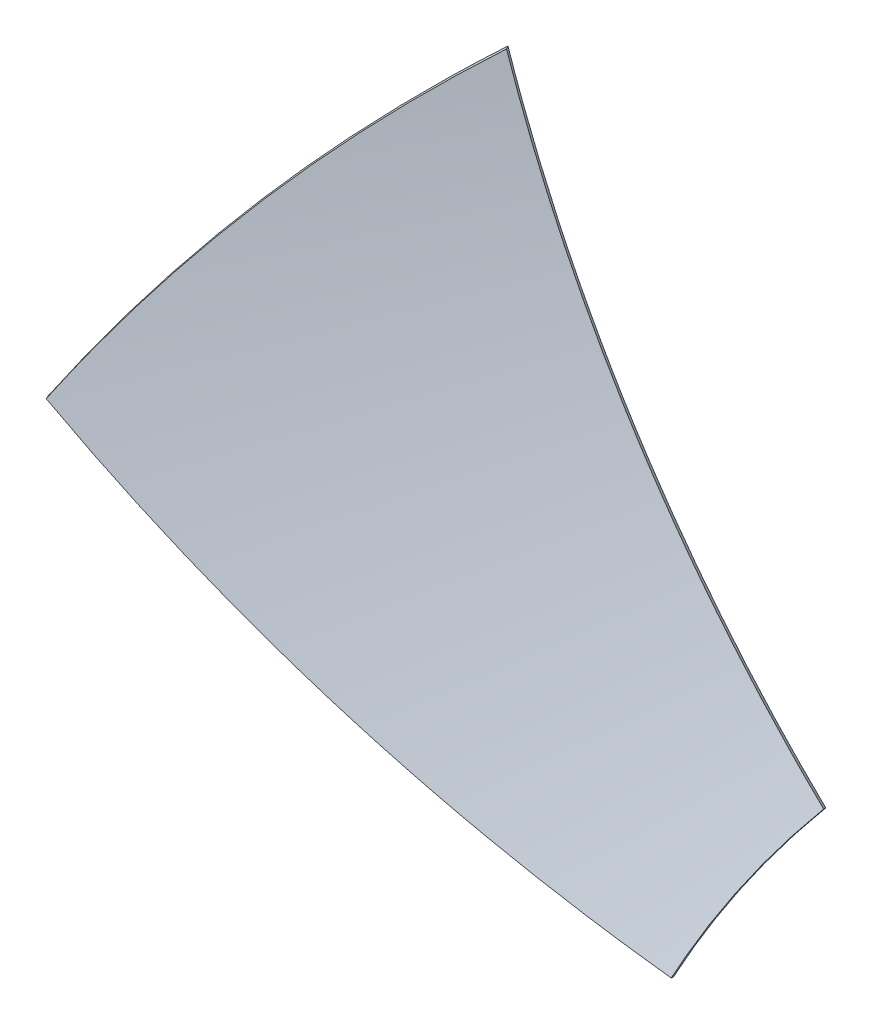
ISO-10303-21;
HEADER;
FILE_DESCRIPTION(('STEP AP214'),'2;1');
FILE_NAME('part.step','',(''),(''),'','','');
FILE_SCHEMA(('AUTOMOTIVE_DESIGN { 1 0 10303 214 1 1 1 1 }'));
ENDSEC;
DATA;
#1=APPLICATION_CONTEXT('core data for automotive mechanical design processes');
#2=APPLICATION_PROTOCOL_DEFINITION('international standard','automotive_design',2000,#1);
#3=PRODUCT_CONTEXT('',#1,'mechanical');
#4=PRODUCT('Part','Part','',(#3));
#5=PRODUCT_RELATED_PRODUCT_CATEGORY('part','',(#4));
#6=PRODUCT_DEFINITION_FORMATION('','',#4);
#7=PRODUCT_DEFINITION_CONTEXT('part definition',#1,'design');
#8=PRODUCT_DEFINITION('design','',#6,#7);
#9=PRODUCT_DEFINITION_SHAPE('','',#8);
#10=(LENGTH_UNIT() NAMED_UNIT(*) SI_UNIT(.MILLI.,.METRE.));
#11=(NAMED_UNIT(*) PLANE_ANGLE_UNIT() SI_UNIT($,.RADIAN.));
#12=(NAMED_UNIT(*) SI_UNIT($,.STERADIAN.) SOLID_ANGLE_UNIT());
#13=UNCERTAINTY_MEASURE_WITH_UNIT(LENGTH_MEASURE(1.E-05),#10,'distance_accuracy_value','');
#14=(GEOMETRIC_REPRESENTATION_CONTEXT(3) GLOBAL_UNCERTAINTY_ASSIGNED_CONTEXT((#13)) GLOBAL_UNIT_ASSIGNED_CONTEXT((#10,
#11,#12)) REPRESENTATION_CONTEXT('',''));
#15=CARTESIAN_POINT('',(0.,0.,0.));
#16=DIRECTION('',(0.,0.,1.));
#17=DIRECTION('',(1.,0.,0.));
#18=AXIS2_PLACEMENT_3D('',#15,#16,#17);
#19=CARTESIAN_POINT('',(145.88739410171,-91.911066445134,-2.70380006520948));
#20=DIRECTION('',(0.,0.,1.));
#21=DIRECTION('',(1.,0.,0.));
#22=AXIS2_PLACEMENT_3D('',#19,#20,#21);
#23=CONICAL_SURFACE('',#22,60.5897364806196,0.959931088596881);
#24=CARTESIAN_POINT('',(110.448391037649,-131.359852117449,-7.99752302693613));
#25=CARTESIAN_POINT('',(110.454538378891,-131.33527791501,-8.01319997647154));
#26=CARTESIAN_POINT('',(110.460747337562,-131.31072775871,-8.02889045343355));
#27=CARTESIAN_POINT('',(110.473289806102,-131.261668621047,-8.06030283110231));
#28=CARTESIAN_POINT('',(110.479623352552,-131.237159654142,-8.07602473978305));
#29=CARTESIAN_POINT('',(110.492414670215,-131.188182884035,-8.1074999805224));
#30=CARTESIAN_POINT('',(110.498872480102,-131.163715096312,-8.12325332094998));
#31=CARTESIAN_POINT('',(110.511911996494,-131.114820668208,-8.15479142477998));
#32=CARTESIAN_POINT('',(110.518493743735,-131.090394044334,-8.17057619693309));
#33=CARTESIAN_POINT('',(110.53178080752,-131.041581925538,-8.20217716383617));
#34=CARTESIAN_POINT('',(110.538486166829,-131.017196448162,-8.21799336770532));
#35=CARTESIAN_POINT('',(110.552020127447,-130.968466600916,-8.24965719767816));
#36=CARTESIAN_POINT('',(110.558848773518,-130.944122249635,-8.26550483325642));
#37=CARTESIAN_POINT('',(110.572628981121,-130.895474631146,-8.29723152627678));
#38=CARTESIAN_POINT('',(110.579580589382,-130.871171383577,-8.31311059353581));
#39=CARTESIAN_POINT('',(110.593606393392,-130.822605943894,-8.34490014964352));
#40=CARTESIAN_POINT('',(110.600680637807,-130.798343772477,-8.36081064863856));
#41=CARTESIAN_POINT('',(110.607814502788,-130.774107256312,-8.37673348223085));
#42=B_SPLINE_CURVE_WITH_KNOTS('',3,(#24,#25,#26,#27,#28,#29,#30,#31,#32,#33,#34,#35,#36,#37,#38,
#39,#40,#41),.UNSPECIFIED.,.F.,.F.,(4,2,2,2,2,2,2,2,4),(0.,0.0893701156271062,0.178766876104449,
0.26819192389929,0.3576468943739,0.447133415688347,0.536653108704645,0.626207586892681,
0.715798456237738),.UNSPECIFIED.);
#43=CARTESIAN_POINT('',(110.44839103765,-131.359852117449,-7.99752302693662));
#44=VERTEX_POINT('',#43);
#45=CARTESIAN_POINT('',(110.607814502788,-130.774107256312,-8.37673348223085));
#46=VERTEX_POINT('',#45);
#47=EDGE_CURVE('E94',#44,#46,#42,.T.);
#48=ORIENTED_EDGE('',*,*,#47,.T.);
#49=CARTESIAN_POINT('',(110.607814827989,-130.774106151476,-8.37673420808281));
#50=CARTESIAN_POINT('',(110.639985249908,-130.66481646931,-8.44853525519903));
#51=CARTESIAN_POINT('',(110.673371042051,-130.556032682132,-8.52059749338112));
#52=CARTESIAN_POINT('',(110.846357850817,-130.014446759972,-8.8823363479189));
#53=CARTESIAN_POINT('',(111.003866832167,-129.589571257958,-9.17568986823083));
#54=CARTESIAN_POINT('',(111.204234658725,-129.114694741501,-9.51462891427878));
#55=CARTESIAN_POINT('',(111.229853898745,-129.055049107714,-9.5574063098381));
#56=CARTESIAN_POINT('',(111.300852809613,-128.892630388317,-9.67445619647831));
#57=CARTESIAN_POINT('',(111.346963223349,-128.790263728789,-9.74885055962443));
#58=CARTESIAN_POINT('',(111.556786564493,-128.337876696355,-10.0804044230892));
#59=CARTESIAN_POINT('',(111.73227018741,-127.994570661752,-10.339494905144));
#60=CARTESIAN_POINT('',(111.974425559886,-127.562240649262,-10.6757424167337));
#61=CARTESIAN_POINT('',(112.029918144488,-127.465694289271,-10.7514987322279));
#62=CARTESIAN_POINT('',(112.277253447827,-127.046248573761,-11.0835809668324));
#63=CARTESIAN_POINT('',(112.479732946404,-126.730674718622,-11.3411904059437));
#64=CARTESIAN_POINT('',(112.693672900404,-126.423618868208,-11.5999996128496));
#65=B_SPLINE_CURVE_WITH_KNOTS('',3,(#49,#50,#51,#52,#53,#54,#55,#56,#57,#58,#59,#60,#61,#62,#63,
#64),.UNSPECIFIED.,.F.,.F.,(4,2,2,2,2,2,2,4),(0.,0.404038905860809,2.02133371872121,
2.25456208219033,2.65859884190079,4.05094813615728,4.45498439560415,5.81918410717478),.UNSPECIFIED.);
#66=CARTESIAN_POINT('',(112.693672901725,-126.423618866313,-11.5999996144472));
#67=VERTEX_POINT('',#66);
#68=EDGE_CURVE('E96',#46,#67,#65,.T.);
#69=ORIENTED_EDGE('',*,*,#68,.T.);
#70=CARTESIAN_POINT('',(112.693672903556,-126.423618864908,-11.5999996160449));
#71=CARTESIAN_POINT('',(112.595443491919,-126.32914324304,-11.5999996494659));
#72=CARTESIAN_POINT('',(112.497620847767,-126.234241239663,-11.6000047399862));
#73=CARTESIAN_POINT('',(112.010504651611,-125.757568613982,-11.6000530761267));
#74=CARTESIAN_POINT('',(111.627366940537,-125.369467727088,-11.6001649766072));
#75=CARTESIAN_POINT('',(110.874672406272,-124.580337034854,-11.6004735845133));
#76=CARTESIAN_POINT('',(110.505115565175,-124.179307246562,-11.600670291827));
#77=CARTESIAN_POINT('',(109.77994696766,-123.364826499554,-11.6010958966151));
#78=CARTESIAN_POINT('',(109.424335195753,-122.951375554637,-11.6013247940537));
#79=CARTESIAN_POINT('',(108.727432053638,-122.112583556248,-11.6017712994751));
#80=CARTESIAN_POINT('',(108.386140670623,-121.687242513411,-11.601988907468));
#81=CARTESIAN_POINT('',(107.718225980457,-120.825178471598,-11.6023789968126));
#82=CARTESIAN_POINT('',(107.391602663457,-120.388455480264,-11.6025514781945));
#83=CARTESIAN_POINT('',(106.91297812094,-119.725293872102,-11.6027589088282));
#84=CARTESIAN_POINT('',(106.755329936813,-119.502906117604,-11.6028195019006));
#85=CARTESIAN_POINT('',(106.288038561008,-118.831710549119,-11.6029726866684));
#86=CARTESIAN_POINT('',(105.984083850709,-118.378917637858,-11.6030366646339));
#87=CARTESIAN_POINT('',(105.391725381369,-117.463292887788,-11.6030799623009));
#88=CARTESIAN_POINT('',(105.1033216208,-117.000461049964,-11.6030592820107));
#89=CARTESIAN_POINT('',(104.542381135892,-116.065258822996,-11.602935824296));
#90=CARTESIAN_POINT('',(104.269844413669,-115.592888432579,-11.6028330468605));
#91=CARTESIAN_POINT('',(103.873227738378,-114.87765432379,-11.6026274061353));
#92=CARTESIAN_POINT('',(103.743060286484,-114.63814299101,-11.6025502856898));
#93=CARTESIAN_POINT('',(103.358657594349,-113.916270515776,-11.6022970818008));
#94=CARTESIAN_POINT('',(103.110551650931,-113.430622256323,-11.6020991678266));
#95=CARTESIAN_POINT('',(102.631041171035,-112.451167853839,-11.6016733387524));
#96=CARTESIAN_POINT('',(102.399636646344,-111.957361705052,-11.6014454236312));
#97=CARTESIAN_POINT('',(101.953833512893,-110.962112767205,-11.6009981951424));
#98=CARTESIAN_POINT('',(101.739434919909,-110.460669971061,-11.6007788817827));
#99=CARTESIAN_POINT('',(101.430856227974,-109.703271550478,-11.6004924206081));
#100=CARTESIAN_POINT('',(101.330171692084,-109.44994706742,-11.6004040220411));
#101=CARTESIAN_POINT('',(100.982433904178,-108.552637769441,-11.6001296377125));
#102=CARTESIAN_POINT('',(100.747180438028,-107.904072354456,-11.6000013307995));
#103=CARTESIAN_POINT('',(100.526180104955,-107.250547083312,-11.5999996160446));
#104=B_SPLINE_CURVE_WITH_KNOTS('',3,(#70,#71,#72,#73,#74,#75,#76,#77,#78,#79,#80,#81,#82,#83,
#84,#85,#86,#87,#88,#89,#90,#91,#92,#93,#94,#95,#96,#97,#98,#99,#100,#101,#102,#103),
.UNSPECIFIED.,.F.,.F.,(4,2,2,2,2,2,2,2,2,2,2,2,2,2,2,2,4),(0.,0.408872020730124,2.0445880705708,
3.68030196370055,5.31601403985159,6.95172465303242,8.5874341677969,9.40520007116332,
11.0409086372335,12.6766170425655,14.3123256660651,15.1300915957316,16.7658012532861,
18.4015120650839,20.0372243942951,20.8549909197946,22.92420054412),.UNSPECIFIED.);
#105=CARTESIAN_POINT('',(100.52618009027,-107.250547073115,-11.5999996085913));
#106=VERTEX_POINT('',#105);
#107=EDGE_CURVE('E73',#67,#106,#104,.T.);
#108=ORIENTED_EDGE('',*,*,#107,.T.);
#109=CARTESIAN_POINT('',(100.526180075585,-107.250547062919,-11.599999601138));
#110=CARTESIAN_POINT('',(100.441324936392,-107.325385260621,-11.5269277928142));
#111=CARTESIAN_POINT('',(100.356768987596,-107.400629395655,-11.4539215705748));
#112=CARTESIAN_POINT('',(100.104012458659,-107.627604284732,-11.235097029347));
#113=CARTESIAN_POINT('',(99.9367365545802,-107.780565956176,-11.0894842771434));
#114=CARTESIAN_POINT('',(99.6877681144773,-108.012532305478,-10.8715012510655));
#115=CARTESIAN_POINT('',(99.6050972039884,-108.090280542329,-10.7989079062299));
#116=CARTESIAN_POINT('',(99.4404191975699,-108.246620471751,-10.6538718996196));
#117=CARTESIAN_POINT('',(99.3584121139781,-108.325212179935,-10.5814292406641));
#118=CARTESIAN_POINT('',(99.1130287548065,-108.562664759361,-10.3639882154032));
#119=CARTESIAN_POINT('',(98.9506948031759,-108.722826643187,-10.2192307695911));
#120=CARTESIAN_POINT('',(98.6287700418738,-109.04644467217,-9.93034021145841));
#121=CARTESIAN_POINT('',(98.4691793165495,-109.209900918284,-9.7862071184366));
#122=CARTESIAN_POINT('',(98.1525483149784,-109.539774771729,-9.49848601100203));
#123=CARTESIAN_POINT('',(97.995508257018,-109.706192629989,-9.35489804403862));
#124=CARTESIAN_POINT('',(97.6842210226098,-110.042155043292,-9.06835455091052));
#125=CARTESIAN_POINT('',(97.5299738283015,-110.211699578328,-8.92539902070576));
#126=CARTESIAN_POINT('',(97.2244515438564,-110.554011397179,-8.64017874156109));
#127=CARTESIAN_POINT('',(97.0731763960015,-110.726778618281,-8.49791397924668));
#128=CARTESIAN_POINT('',(96.773720308594,-111.075559721707,-8.21411210644342));
#129=CARTESIAN_POINT('',(96.6255393944931,-111.251573630714,-8.07257500194714));
#130=CARTESIAN_POINT('',(96.1857335171657,-111.78433788711,-7.64909816116586));
#131=CARTESIAN_POINT('',(95.8988003533564,-112.145861243344,-7.36825085191799));
#132=CARTESIAN_POINT('',(95.4782689179051,-112.69660987447,-6.94954274143506));
#133=CARTESIAN_POINT('',(95.3398972502636,-112.881375720383,-6.81056637979575));
#134=CARTESIAN_POINT('',(95.0663612922474,-113.253782293722,-6.53336775504512));
#135=CARTESIAN_POINT('',(94.9311966371304,-113.441422690184,-6.3951454075681));
#136=CARTESIAN_POINT('',(94.5305374479167,-114.008602419277,-5.98158599832814));
#137=CARTESIAN_POINT('',(94.2698842146468,-114.392391745062,-5.70736306325411));
#138=CARTESIAN_POINT('',(93.7619368186367,-115.170865573477,-5.16201392766748));
#139=CARTESIAN_POINT('',(93.5146426864306,-115.565550101007,-4.89088773423403));
#140=CARTESIAN_POINT('',(93.154183537094,-116.165468508236,-4.48668057052745));
#141=CARTESIAN_POINT('',(93.0357831029994,-116.366746410406,-4.35236513137622));
#142=CARTESIAN_POINT('',(92.7044963021591,-116.942250503265,-3.97199708233509));
#143=CARTESIAN_POINT('',(92.4958647468823,-117.319605559852,-3.72694510964173));
#144=CARTESIAN_POINT('',(92.0911163029729,-118.08338601503,-3.23966354679029));
#145=CARTESIAN_POINT('',(91.8950120710661,-118.469820063786,-2.99743700701945));
#146=CARTESIAN_POINT('',(91.7056010996255,-118.860514200795,-2.75685890943749));
#147=B_SPLINE_CURVE_WITH_KNOTS('',3,(#109,#110,#111,#112,#113,#114,#115,#116,#117,#118,#119,
#120,#121,#122,#123,#124,#125,#126,#127,#128,#129,#130,#131,#132,#133,#134,#135,#136,#137,#138,
#139,#140,#141,#142,#143,#144,#145,#146),.UNSPECIFIED.,.F.,.F.,(4,2,2,2,2,2,2,2,2,2,2,2,2,2,2,2,
2,2,4),(0.,0.404064071678144,1.21225536084814,1.61640707214662,2.02056627777049,2.8308529751671,
3.64116454242181,4.45154509470655,5.26192046269926,6.07228007729671,6.88264635489911,
8.50314002327528,9.31144192690703,10.1196514551796,11.736108176728,13.3525685927589,
14.1607187110391,15.6483307902936,17.1374228229095),.UNSPECIFIED.);
#148=CARTESIAN_POINT('',(91.7056010996254,-118.860514200795,-2.75685890943717));
#149=VERTEX_POINT('',#148);
#150=EDGE_CURVE('E69',#106,#149,#147,.T.);
#151=ORIENTED_EDGE('',*,*,#150,.T.);
#152=CARTESIAN_POINT('',(91.7056010996253,-118.860514200795,-2.75685890943694));
#153=CARTESIAN_POINT('',(91.797999099969,-118.954591802416,-2.78545031277596));
#154=CARTESIAN_POINT('',(91.8907318193919,-119.04832956558,-2.81408465062322));
#155=CARTESIAN_POINT('',(92.3560886074387,-119.515344523519,-2.95747718472562));
#156=CARTESIAN_POINT('',(92.7336885822292,-119.883494085374,-3.07286579182448));
#157=CARTESIAN_POINT('',(93.4991116710984,-120.608606195914,-3.30487051877574));
#158=CARTESIAN_POINT('',(93.8869347739485,-120.965568756885,-3.42148663727982));
#159=CARTESIAN_POINT('',(94.4760436580709,-121.492413370511,-3.59725720170259));
#160=CARTESIAN_POINT('',(94.6736348441904,-121.666588723844,-3.65598625597299));
#161=CARTESIAN_POINT('',(95.2700921211457,-122.184820435745,-3.8326007829354));
#162=CARTESIAN_POINT('',(95.6726133770275,-122.524556166096,-3.9509050346662));
#163=CARTESIAN_POINT('',(96.2833887115879,-123.025258786922,-4.12913475600895));
#164=CARTESIAN_POINT('',(96.4881383962491,-123.19067023734,-4.18867134707746));
#165=CARTESIAN_POINT('',(97.1058917483487,-123.682455580297,-4.36767964680681));
#166=CARTESIAN_POINT('',(97.5223699394594,-124.004355333684,-4.48754113247319));
#167=CARTESIAN_POINT('',(98.1537233128239,-124.477981594323,-4.6680659002562));
#168=CARTESIAN_POINT('',(98.3652725280436,-124.634314191228,-4.72836067572357));
#169=CARTESIAN_POINT('',(99.0032496911098,-125.098681713732,-4.90963337826445));
#170=CARTESIAN_POINT('',(99.4329760059577,-125.402062290664,-5.03099071927939));
#171=CARTESIAN_POINT('',(100.300810563139,-125.996186841655,-5.27461141686636));
#172=CARTESIAN_POINT('',(100.738918795833,-126.286930830245,-5.39687477239637));
#173=CARTESIAN_POINT('',(101.623129447332,-126.85565727751,-5.64217874674722));
#174=CARTESIAN_POINT('',(102.069231857301,-127.133639750291,-5.7652193647088));
#175=CARTESIAN_POINT('',(102.96905203662,-127.676677712553,-6.01197262843066));
#176=CARTESIAN_POINT('',(103.422769800579,-127.941733211187,-6.13568527371509));
#177=CARTESIAN_POINT('',(104.337452265398,-128.458744304297,-6.38368969010932));
#178=CARTESIAN_POINT('',(104.798416963906,-128.710699903023,-6.5079814610312));
#179=CARTESIAN_POINT('',(105.727233270513,-129.201320743226,-6.75706738199267));
#180=CARTESIAN_POINT('',(106.195084878947,-129.439985984056,-6.8818615320567));
#181=CARTESIAN_POINT('',(107.137312505872,-129.903819011916,-7.13188626946939));
#182=CARTESIAN_POINT('',(107.611688527068,-130.12898679335,-7.25711685699898));
#183=CARTESIAN_POINT('',(108.867589792305,-130.703207822183,-7.58703757426469));
#184=CARTESIAN_POINT('',(109.654244139479,-131.040887534019,-7.7920575680131));
#185=CARTESIAN_POINT('',(110.448391037649,-131.359852117449,-7.99752302693662));
#186=B_SPLINE_CURVE_WITH_KNOTS('',3,(#152,#153,#154,#155,#156,#157,#158,#159,#160,#161,#162,
#163,#164,#165,#166,#167,#168,#169,#170,#171,#172,#173,#174,#175,#176,#177,#178,#179,#180,#181,
#182,#183,#184,#185),.UNSPECIFIED.,.F.,.F.,(4,2,2,2,2,2,2,2,2,2,2,2,2,2,2,2,4),(0.,
0.404785757843062,2.02408053151727,3.64337352671859,4.45295985208373,6.07225169933995,
6.88183799918349,8.50113035989841,9.31071683189178,10.9300108744862,12.5493030550257,
14.1685934457541,15.7878826900421,17.4071714089507,19.026460206653,20.6457496757599,
23.2857210131077),.UNSPECIFIED.);
#187=EDGE_CURVE('E24',#149,#44,#186,.T.);
#188=ORIENTED_EDGE('',*,*,#187,.T.);
#189=EDGE_LOOP('',(#48,#69,#108,#151,#188));
#190=FACE_BOUND('',#189,.T.);
#191=ADVANCED_FACE('F17',(#190),#23,.F.);
#192=CARTESIAN_POINT('',(110.370961529788,-131.446042466957,-8.16299173988275));
#193=CARTESIAN_POINT('',(110.371217072719,-131.445758010358,-8.16244563851989));
#194=CARTESIAN_POINT('',(110.371472615649,-131.445473553759,-8.16189953715703));
#195=CARTESIAN_POINT('',(110.371728158579,-131.44518909716,-8.16135343579417));
#196=CARTESIAN_POINT('',(110.397282451603,-131.416743437256,-8.10674329950824));
#197=CARTESIAN_POINT('',(110.422836744626,-131.388297777353,-8.0521331632223));
#198=CARTESIAN_POINT('',(110.448391037649,-131.359852117449,-7.99752302693637));
#199=CARTESIAN_POINT('',(106.363861818276,-129.833425444528,-7.12789737510283));
#200=CARTESIAN_POINT('',(106.364139101076,-129.833160512215,-7.12735127373997));
#201=CARTESIAN_POINT('',(106.364416383877,-129.832895579903,-7.12680517237711));
#202=CARTESIAN_POINT('',(106.364693666677,-129.83263064759,-7.12625907101425));
#203=CARTESIAN_POINT('',(106.392421946705,-129.80613741632,-7.07164893472831));
#204=CARTESIAN_POINT('',(106.420145244575,-129.779641457908,-7.01703879844238));
#205=CARTESIAN_POINT('',(106.447873524603,-129.753148226638,-6.96242866215644));
#206=CARTESIAN_POINT('',(99.6234104154961,-126.149092471883,-5.31571711480843));
#207=CARTESIAN_POINT('',(99.6237205225811,-126.148864940785,-5.31517101344557));
#208=CARTESIAN_POINT('',(99.624030629666,-126.148637409686,-5.31462491208271));
#209=CARTESIAN_POINT('',(99.624340736751,-126.148409878588,-5.31407881071985));
#210=CARTESIAN_POINT('',(99.6553514452475,-126.125656768751,-5.25946867443392));
#211=CARTESIAN_POINT('',(99.6863640654172,-126.102904979998,-5.20485853814798));
#212=CARTESIAN_POINT('',(99.7173747739136,-126.080151870161,-5.15024840186205));
#213=CARTESIAN_POINT('',(93.8469783855449,-121.200618312325,-3.61624611019745));
#214=CARTESIAN_POINT('',(93.8473121958241,-121.200430805295,-3.61570000883459));
#215=CARTESIAN_POINT('',(93.8476460061032,-121.200243298264,-3.61515390747173));
#216=CARTESIAN_POINT('',(93.8479798163823,-121.200055791233,-3.61460780610887));
#217=CARTESIAN_POINT('',(93.881360844295,-121.181305088156,-3.55999766982294));
#218=CARTESIAN_POINT('',(93.9147412582133,-121.162553845972,-3.50538753353701));
#219=CARTESIAN_POINT('',(93.948122286126,-121.143803142895,-3.45077739725108));
#220=CARTESIAN_POINT('',(91.6018624798671,-118.912112687271,-2.92232762238329));
#221=CARTESIAN_POINT('',(91.6022048515495,-118.911942395236,-2.92178152102043));
#222=CARTESIAN_POINT('',(91.6025472232318,-118.911772103202,-2.92123541965757));
#223=CARTESIAN_POINT('',(91.6028895949142,-118.911601811167,-2.92068931829471));
#224=CARTESIAN_POINT('',(91.6371267631512,-118.89457260771,-2.86607918200878));
#225=CARTESIAN_POINT('',(91.6713639313882,-118.877543404253,-2.81146904572284));
#226=CARTESIAN_POINT('',(91.7056010996253,-118.860514200795,-2.75685890943691));
#227=B_SPLINE_SURFACE_WITH_KNOTS('',3,3,((#192,#193,#194,#195,#196,#197,#198),(#199,#200,#201,
#202,#203,#204,#205),(#206,#207,#208,#209,#210,#211,#212),(#213,#214,#215,#216,#217,#218,#219),
(#220,#221,#222,#223,#224,#225,#226)),.UNSPECIFIED.,.F.,.F.,.F.,(4,1,4),(4,3,4),(0.,
0.571428571428571,1.),(-0.01,0.,1.),.UNSPECIFIED.);
#228=DIRECTION('',(0.383314395357716,0.426684898557501,0.819152044283919));
#229=VECTOR('',#228,1.);
#230=CARTESIAN_POINT('',(110.41044291251,-131.402093922406,-8.07861907932099));
#231=LINE('',#230,#229);
#232=CARTESIAN_POINT('',(110.373505586871,-131.443209667115,-8.1575536178931));
#233=VERTEX_POINT('',#232);
#234=EDGE_CURVE('E82',#233,#44,#231,.T.);
#235=DIRECTION('',(-0.513557523553809,-0.255438051869439,-0.8191520442863));
#236=VECTOR('',#235,1.);
#237=CARTESIAN_POINT('',(91.65424534727,-118.886058005981,-2.8387741138661));
#238=LINE('',#237,#236);
#239=CARTESIAN_POINT('',(91.6028895910298,-118.9116018192,-2.92068931335491));
#240=VERTEX_POINT('',#239);
#241=EDGE_CURVE('E77',#149,#240,#238,.T.);
#242=CARTESIAN_POINT('',(110.373504997681,-131.443209430175,-8.1575534659389));
#243=CARTESIAN_POINT('',(110.252963072418,-131.394734157633,-8.12646529120606));
#244=CARTESIAN_POINT('',(110.132590927525,-131.345826370974,-8.09538661545343));
#245=CARTESIAN_POINT('',(109.531551155646,-131.099117256437,-7.94003106917737));
#246=CARTESIAN_POINT('',(109.053476821751,-130.894857479163,-7.81590131024393));
#247=CARTESIAN_POINT('',(108.103254325674,-130.472820642985,-7.56799500365023));
#248=CARTESIAN_POINT('',(107.631106157523,-130.255043597692,-7.4442184556344));
#249=CARTESIAN_POINT('',(106.693062857284,-129.806187918665,-7.19705562788169));
#250=CARTESIAN_POINT('',(106.227167721051,-129.57510929375,-7.07366934788614));
#251=CARTESIAN_POINT('',(105.302002163962,-129.099872298025,-6.82735063774555));
#252=CARTESIAN_POINT('',(104.842731741005,-128.855713931367,-6.70441820745653));
#253=CARTESIAN_POINT('',(103.474986563417,-128.103690598122,-6.33629505547561));
#254=CARTESIAN_POINT('',(102.576844056286,-127.576404780334,-6.09184856939984));
#255=CARTESIAN_POINT('',(101.252976826846,-126.747977871842,-5.72735750162617));
#256=CARTESIAN_POINT('',(100.815638910567,-126.465628362245,-5.60624052790909));
#257=CARTESIAN_POINT('',(99.9489750286305,-125.888500009708,-5.36480844305108));
#258=CARTESIAN_POINT('',(99.5196490721165,-125.593721152584,-5.24449333282534));
#259=CARTESIAN_POINT('',(98.8820235641118,-125.142372223197,-5.06473681624484));
#260=CARTESIAN_POINT('',(98.6705498090488,-124.990398117559,-5.00493947854554));
#261=CARTESIAN_POINT('',(98.0393015750367,-124.529889704488,-4.8258918912612));
#262=CARTESIAN_POINT('',(97.622731258631,-124.216790677508,-4.7069947901815));
#263=CARTESIAN_POINT('',(97.0045926740954,-123.738300763027,-4.52939440412343));
#264=CARTESIAN_POINT('',(96.7996732980041,-123.577336582714,-4.47032062315782));
#265=CARTESIAN_POINT('',(95.7803768583821,-122.764926080951,-4.17546759268048));
#266=CARTESIAN_POINT('',(94.9827954371385,-122.091396503552,-3.94149231997307));
#267=CARTESIAN_POINT('',(93.7579130379012,-120.996087732085,-3.57668669274213));
#268=CARTESIAN_POINT('',(93.3175612891433,-120.589236927786,-3.44436095392647));
#269=CARTESIAN_POINT('',(92.4501516014881,-119.761146057062,-3.18130270988215));
#270=CARTESIAN_POINT('',(92.0230930637054,-119.339906640672,-3.05057013304034));
#271=CARTESIAN_POINT('',(91.6028896336833,-118.911601850685,-2.92068933027757));
#272=B_SPLINE_CURVE_WITH_KNOTS('',3,(#242,#243,#244,#245,#246,#247,#248,#249,#250,#251,#252,
#253,#254,#255,#256,#257,#258,#259,#260,#261,#262,#263,#264,#265,#266,#267,#268,#269,#270,#271),
.UNSPECIFIED.,.F.,.F.,(4,2,2,2,2,2,2,2,2,2,2,2,2,2,4),(0.,0.400777878005566,2.00403380542941,
3.60728811828918,5.21054136822179,6.81379410946475,10.0212082771642,11.6244629152101,
13.2277193827625,14.0292898187264,15.6325469300771,16.4341171316611,19.6415535041823,
21.4831738583115,23.3247111233784),.UNSPECIFIED.);
#273=EDGE_CURVE('E158',#233,#240,#272,.T.);
#274=ORIENTED_EDGE('',*,*,#234,.T.);
#275=ORIENTED_EDGE('',*,*,#187,.F.);
#276=ORIENTED_EDGE('',*,*,#241,.T.);
#277=ORIENTED_EDGE('',*,*,#273,.F.);
#278=EDGE_LOOP('',(#274,#275,#276,#277));
#279=FACE_BOUND('',#278,.T.);
#280=ADVANCED_FACE('F79',(#279),#227,.F.);
#281=CARTESIAN_POINT('',(91.6018624798673,-118.912112687271,-2.9223276223835));
#282=CARTESIAN_POINT('',(91.6022048515497,-118.911942395236,-2.92178152102064));
#283=CARTESIAN_POINT('',(91.602547223232,-118.911772103202,-2.92123541965778));
#284=CARTESIAN_POINT('',(91.6028895949144,-118.911601811167,-2.92068931829492));
#285=CARTESIAN_POINT('',(91.6371267631514,-118.894572607709,-2.86607918200904));
#286=CARTESIAN_POINT('',(91.6713639313885,-118.877543404252,-2.81146904572316));
#287=CARTESIAN_POINT('',(91.7056010996256,-118.860514200795,-2.75685890943729));
#288=CARTESIAN_POINT('',(91.7059468950248,-118.86034220584,-2.7563073470608));
#289=CARTESIAN_POINT('',(91.706292690424,-118.860170210885,-2.75575578468432));
#290=CARTESIAN_POINT('',(91.7066384858232,-118.85999821593,-2.75520422230783));
#291=CARTESIAN_POINT('',(92.8888444789875,-116.250904025601,-4.55903629348514));
#292=CARTESIAN_POINT('',(92.889191941145,-116.250743955704,-4.55849019212228));
#293=CARTESIAN_POINT('',(92.8895394033026,-116.250583885806,-4.55794409075942));
#294=CARTESIAN_POINT('',(92.8898868654601,-116.250423815909,-4.55739798939656));
#295=CARTESIAN_POINT('',(92.9246330812129,-116.234416826181,-4.50278785311068));
#296=CARTESIAN_POINT('',(92.959376944454,-116.218408781574,-4.44817771682478));
#297=CARTESIAN_POINT('',(92.9941231602068,-116.202401791846,-4.3935675805389));
#298=CARTESIAN_POINT('',(92.9944740969859,-116.20224012125,-4.39301601816241));
#299=CARTESIAN_POINT('',(92.994825033765,-116.202078450653,-4.39246445578593));
#300=CARTESIAN_POINT('',(92.9951759705441,-116.201916780057,-4.39191289340944));
#301=CARTESIAN_POINT('',(95.0759582189656,-112.887087073722,-6.90064457452074));
#302=CARTESIAN_POINT('',(95.0763115968289,-112.886940536198,-6.90009847315788));
#303=CARTESIAN_POINT('',(95.0766649746922,-112.886793998673,-6.89955237179502));
#304=CARTESIAN_POINT('',(95.0770183525555,-112.886647461149,-6.89900627043216));
#305=CARTESIAN_POINT('',(95.1123561388839,-112.871993708715,-6.84439613414625));
#306=CARTESIAN_POINT('',(95.1476933550837,-112.857338547525,-6.78978599786036));
#307=CARTESIAN_POINT('',(95.1830311414121,-112.84268479509,-6.73517586157446));
#308=CARTESIAN_POINT('',(95.183388053054,-112.84253679219,-6.73462429919797));
#309=CARTESIAN_POINT('',(95.1837449646959,-112.842388789291,-6.73407273682148));
#310=CARTESIAN_POINT('',(95.1841018763379,-112.842240786391,-6.733521174445));
#311=CARTESIAN_POINT('',(97.6981704497479,-109.92269495487,-9.35519550010226));
#312=CARTESIAN_POINT('',(97.6985286187858,-109.922560987923,-9.3546493987394));
#313=CARTESIAN_POINT('',(97.6988867878238,-109.922427020975,-9.35410329737654));
#314=CARTESIAN_POINT('',(97.6992449568617,-109.922293054028,-9.35355719601368));
#315=CARTESIAN_POINT('',(97.7350618606562,-109.908896359294,-9.29894705972777));
#316=CARTESIAN_POINT('',(97.7708799431355,-109.8955022818,-9.24433692344185));
#317=CARTESIAN_POINT('',(97.8066968469301,-109.882105587066,-9.18972678715594));
#318=CARTESIAN_POINT('',(97.8070585976584,-109.881970280449,-9.18917522477945));
#319=CARTESIAN_POINT('',(97.8074203483868,-109.881834973832,-9.18862366240297));
#320=CARTESIAN_POINT('',(97.8077820991151,-109.881699667216,-9.18807210002648));
#321=CARTESIAN_POINT('',(99.1407985543467,-108.452492623889,-10.6557862259187));
#322=CARTESIAN_POINT('',(99.141159034587,-108.452365022112,-10.6552401245558));
#323=CARTESIAN_POINT('',(99.1415195148273,-108.452237420336,-10.654694023193));
#324=CARTESIAN_POINT('',(99.1418799950676,-108.452109818559,-10.6541479218301));
#325=CARTESIAN_POINT('',(99.1779280190991,-108.439349640885,-10.5995377855441));
#326=CARTESIAN_POINT('',(99.2139745859709,-108.426586581207,-10.5449276492582));
#327=CARTESIAN_POINT('',(99.2500226100024,-108.413826403533,-10.4903175129723));
#328=CARTESIAN_POINT('',(99.2503866950451,-108.413697525738,-10.4897659505958));
#329=CARTESIAN_POINT('',(99.2507507800878,-108.413568647944,-10.4892143882193));
#330=CARTESIAN_POINT('',(99.2511148651305,-108.413439770149,-10.4886628258428));
#331=CARTESIAN_POINT('',(99.8959753749966,-107.747473562299,-11.3171126533402));
#332=CARTESIAN_POINT('',(99.8963369151468,-107.747349024265,-11.3165665519773));
#333=CARTESIAN_POINT('',(99.896698455297,-107.747224486231,-11.3160204506145));
#334=CARTESIAN_POINT('',(99.8970599954472,-107.747099948197,-11.3154743492516));
#335=CARTESIAN_POINT('',(99.9332140104664,-107.734646144794,-11.2608642129657));
#336=CARTESIAN_POINT('',(99.9693701510365,-107.72219690909,-11.2062540766797));
#337=CARTESIAN_POINT('',(100.005524166056,-107.709743105687,-11.1516439403938));
#338=CARTESIAN_POINT('',(100.005889321608,-107.709617322273,-11.1510923780173));
#339=CARTESIAN_POINT('',(100.006254477159,-107.709491538858,-11.1505408156408));
#340=CARTESIAN_POINT('',(100.006619632711,-107.709365755444,-11.1499892532643));
#341=CARTESIAN_POINT('',(100.416423367232,-107.287662715088,-11.7654683091632));
#342=CARTESIAN_POINT('',(100.416785600574,-107.287540221203,-11.7649222078003));
#343=CARTESIAN_POINT('',(100.417147833916,-107.287417727318,-11.7643761064375));
#344=CARTESIAN_POINT('',(100.417510067258,-107.287295233433,-11.7638300050746));
#345=CARTESIAN_POINT('',(100.453733401462,-107.275045844942,-11.7092198687886));
#346=CARTESIAN_POINT('',(100.489956735666,-107.26279645645,-11.6546097325027));
#347=CARTESIAN_POINT('',(100.52618006987,-107.250547067959,-11.5999995962168));
#348=CARTESIAN_POINT('',(100.526545925545,-107.250423349135,-11.5994480338403));
#349=CARTESIAN_POINT('',(100.526911781221,-107.250299630311,-11.5988964714638));
#350=CARTESIAN_POINT('',(100.527277636896,-107.250175911488,-11.5983449090873));
#351=B_SPLINE_SURFACE_WITH_KNOTS('',3,3,((#281,#282,#283,#284,#285,#286,#287,#288,#289,#290),
(#291,#292,#293,#294,#295,#296,#297,#298,#299,#300),(#301,#302,#303,#304,#305,#306,#307,#308,
#309,#310),(#311,#312,#313,#314,#315,#316,#317,#318,#319,#320),(#321,#322,#323,#324,#325,#326,
#327,#328,#329,#330),(#331,#332,#333,#334,#335,#336,#337,#338,#339,#340),(#341,#342,#343,#344,
#345,#346,#347,#348,#349,#350)),.UNSPECIFIED.,.F.,.F.,.F.,(4,1,1,1,4),(4,3,3,4),(0.,
0.571428571428571,0.785714285714286,0.857142857142857,1.),(-0.01,0.,1.,1.0101),.UNSPECIFIED.);
#352=DIRECTION('',(-0.543350012971076,-0.183740827651331,-0.819152044286245));
#353=VECTOR('',#352,1.);
#354=CARTESIAN_POINT('',(100.470874351393,-107.269249464532,-11.6833783341485));
#355=LINE('',#354,#353);
#356=CARTESIAN_POINT('',(100.417838446721,-107.287184305039,-11.7633350556308));
#357=VERTEX_POINT('',#356);
#358=EDGE_CURVE('E89',#106,#357,#355,.T.);
#359=CARTESIAN_POINT('',(91.6028895871452,-118.911601827232,-2.92068930841487));
#360=CARTESIAN_POINT('',(91.6536831503237,-118.806575151559,-2.98528436367112));
#361=CARTESIAN_POINT('',(91.7049622787089,-118.701854867922,-3.04999986484392));
#362=CARTESIAN_POINT('',(91.9637799993693,-118.179736901183,-3.37420276624638));
#363=CARTESIAN_POINT('',(92.1785007023105,-117.766964942039,-3.63545883405034));
#364=CARTESIAN_POINT('',(92.6229679258419,-116.950452323891,-4.16211147739509));
#365=CARTESIAN_POINT('',(92.8527527349465,-116.546738478731,-4.42751718623929));
#366=CARTESIAN_POINT('',(93.3261553280007,-115.749656717399,-4.96159561146022));
#367=CARTESIAN_POINT('',(93.5697742151228,-115.35628962998,-5.2302685870327));
#368=CARTESIAN_POINT('',(94.0702422559801,-114.580250547149,-5.77067862765028));
#369=CARTESIAN_POINT('',(94.3270910451771,-114.197578257499,-6.04241560810844));
#370=CARTESIAN_POINT('',(94.8535621166824,-113.443335512252,-6.58882537599907));
#371=CARTESIAN_POINT('',(95.1231831324739,-113.07176396182,-6.8634978702577));
#372=CARTESIAN_POINT('',(95.536587467825,-112.523621088673,-7.27728725344189));
#373=CARTESIAN_POINT('',(95.6756890284784,-112.34268251495,-7.41532478315281));
#374=CARTESIAN_POINT('',(95.9569876578684,-111.983746711201,-7.69213384293503));
#375=CARTESIAN_POINT('',(96.099185086699,-111.805749827618,-7.83090545695441));
#376=CARTESIAN_POINT('',(96.386651224556,-111.452813441215,-8.10917207615995));
#377=CARTESIAN_POINT('',(96.5319200475809,-111.277874052321,-8.24866710805106));
#378=CARTESIAN_POINT('',(96.8254980316318,-110.931151785399,-8.528371245689));
#379=CARTESIAN_POINT('',(96.9738071459454,-110.75936885895,-8.66858034043984));
#380=CARTESIAN_POINT('',(97.2733660740347,-110.418959732879,-8.94968350287563));
#381=CARTESIAN_POINT('',(97.4246158706793,-110.250333514879,-9.09057756656669));
#382=CARTESIAN_POINT('',(97.7299090176966,-109.916183902491,-9.37300252973848));
#383=CARTESIAN_POINT('',(97.8839523029591,-109.750660435968,-9.51453341431863));
#384=CARTESIAN_POINT('',(98.1945927776547,-109.42251580302,-9.79815541297133));
#385=CARTESIAN_POINT('',(98.3511899720448,-109.259894642229,-9.94024652813082));
#386=CARTESIAN_POINT('',(98.6630523231697,-108.941695102918,-10.2214725393245));
#387=CARTESIAN_POINT('',(98.8182540537562,-108.786042105384,-10.3605932642972));
#388=CARTESIAN_POINT('',(99.1312717037904,-108.477943929218,-10.6394427985723));
#389=CARTESIAN_POINT('',(99.2890876071896,-108.325498730905,-10.7791716041379));
#390=CARTESIAN_POINT('',(99.6073508661613,-108.023606286906,-11.0593297690406));
#391=CARTESIAN_POINT('',(99.7678005915784,-107.874162044342,-11.1997596701081));
#392=CARTESIAN_POINT('',(100.091070880171,-107.578366257434,-11.4811549244899));
#393=CARTESIAN_POINT('',(100.253891480647,-107.432014761837,-11.6221202862028));
#394=CARTESIAN_POINT('',(100.417838286112,-107.287184295522,-11.763334951219));
#395=B_SPLINE_CURVE_WITH_KNOTS('',3,(#359,#360,#361,#362,#363,#364,#365,#366,#367,#368,#369,
#370,#371,#372,#373,#374,#375,#376,#377,#378,#379,#380,#381,#382,#383,#384,#385,#386,#387,#388,
#389,#390,#391,#392,#393,#394),.UNSPECIFIED.,.F.,.F.,(4,2,2,2,2,2,2,2,2,2,2,2,2,2,2,2,2,4),(0.,
0.400064410909991,2.00054428639484,3.60526289523313,5.21010964952083,6.81491220729134,
8.41955596172841,9.21970319527912,10.0199440000364,10.8202145589967,11.620472831486,
12.4207264434377,13.2209614271039,14.021197964134,14.80157034741,15.5819379417698,
16.3630510349946,17.1441764307269),.UNSPECIFIED.);
#396=EDGE_CURVE('E86',#240,#357,#395,.T.);
#397=ORIENTED_EDGE('',*,*,#241,.F.);
#398=ORIENTED_EDGE('',*,*,#150,.F.);
#399=ORIENTED_EDGE('',*,*,#358,.T.);
#400=ORIENTED_EDGE('',*,*,#396,.F.);
#401=EDGE_LOOP('',(#397,#398,#399,#400));
#402=FACE_BOUND('',#401,.T.);
#403=ADVANCED_FACE('F84',(#402),#351,.F.);
#404=CARTESIAN_POINT('',(100.415568844611,-107.287951736268,-11.766756668297));
#405=CARTESIAN_POINT('',(100.416215848268,-107.287732943621,-11.7657812484839));
#406=CARTESIAN_POINT('',(100.416862851924,-107.287514150975,-11.7648058286709));
#407=CARTESIAN_POINT('',(100.417509855581,-107.287295358328,-11.7638304088578));
#408=CARTESIAN_POINT('',(100.453733189779,-107.275045969818,-11.7092202725719));
#409=CARTESIAN_POINT('',(100.489956523977,-107.262796581307,-11.6546101362859));
#410=CARTESIAN_POINT('',(100.526179858174,-107.250547192797,-11.6));
#411=CARTESIAN_POINT('',(100.526548561553,-107.250422510985,-11.599444144439));
#412=CARTESIAN_POINT('',(100.526917264931,-107.250297829174,-11.598888288878));
#413=CARTESIAN_POINT('',(100.52728596831,-107.250173147362,-11.598332433317));
#414=CARTESIAN_POINT('',(102.869635127452,-114.54500583378,-11.766756668297));
#415=CARTESIAN_POINT('',(102.870247306292,-114.5446837287,-11.7657812484839));
#416=CARTESIAN_POINT('',(102.870859485132,-114.544361623621,-11.7648058286709));
#417=CARTESIAN_POINT('',(102.871471663972,-114.544039518542,-11.7638304088578));
#418=CARTESIAN_POINT('',(102.905745285892,-114.526006050248,-11.7092202725719));
#419=CARTESIAN_POINT('',(102.940003238953,-114.507981684839,-11.6546101362859));
#420=CARTESIAN_POINT('',(102.974276860874,-114.489948216545,-11.6));
#421=CARTESIAN_POINT('',(102.974625718882,-114.489764660811,-11.599444144439));
#422=CARTESIAN_POINT('',(102.974974576889,-114.489581105078,-11.598888288878));
#423=CARTESIAN_POINT('',(102.975323434897,-114.489397549344,-11.598332433317));
#424=CARTESIAN_POINT('',(107.091286113774,-121.197322682569,-11.766756668297));
#425=CARTESIAN_POINT('',(107.0918382196,-121.196905916723,-11.7657812484839));
#426=CARTESIAN_POINT('',(107.092390325427,-121.196489150876,-11.7648058286709));
#427=CARTESIAN_POINT('',(107.092942431253,-121.19607238503,-11.7638304088578));
#428=CARTESIAN_POINT('',(107.123852788023,-121.172739211593,-11.7092202725719));
#429=CARTESIAN_POINT('',(107.154748236697,-121.149416339824,-11.6546101362859));
#430=CARTESIAN_POINT('',(107.185658593466,-121.126083166386,-11.6));
#431=CARTESIAN_POINT('',(107.185973218092,-121.125845666993,-11.599444144439));
#432=CARTESIAN_POINT('',(107.186287842718,-121.1256081676,-11.598888288878));
#433=CARTESIAN_POINT('',(107.186602467344,-121.125370668207,-11.598332433317));
#434=CARTESIAN_POINT('',(112.612731516059,-126.507776162677,-11.766756668297));
#435=CARTESIAN_POINT('',(112.613204970297,-126.507283897465,-11.7657812484839));
#436=CARTESIAN_POINT('',(112.613678424534,-126.506791632253,-11.7648058286709));
#437=CARTESIAN_POINT('',(112.614151878772,-126.506299367041,-11.7638304088578));
#438=CARTESIAN_POINT('',(112.640658824911,-126.478739264254,-11.7092202725719));
#439=CARTESIAN_POINT('',(112.667165771051,-126.451179161466,-11.6546101362859));
#440=CARTESIAN_POINT('',(112.69367271719,-126.423619058679,-11.6));
#441=CARTESIAN_POINT('',(112.693942521194,-126.423338534999,-11.599444144439));
#442=CARTESIAN_POINT('',(112.694212325198,-126.423058011319,-11.598888288878));
#443=CARTESIAN_POINT('',(112.694482129201,-126.422777487639,-11.598332433317));
#444=B_SPLINE_SURFACE_WITH_KNOTS('',3,3,((#404,#405,#406,#407,#408,#409,#410,#411,#412,#413),
(#414,#415,#416,#417,#418,#419,#420,#421,#422,#423),(#424,#425,#426,#427,#428,#429,#430,#431,
#432,#433),(#434,#435,#436,#437,#438,#439,#440,#441,#442,#443)),.UNSPECIFIED.,.F.,.F.,.F.,(4,4),
(4,3,3,4),(0.,1.),(-0.0178615158172506,0.,1.,1.01017861515817),.UNSPECIFIED.);
#445=DIRECTION('',(-0.397604192086449,-0.413401541806731,-0.819152044291595));
#446=VECTOR('',#445,1.);
#447=CARTESIAN_POINT('',(112.654310085447,-126.464545620763,-11.6810956653055));
#448=LINE('',#447,#446);
#449=CARTESIAN_POINT('',(112.615682354169,-126.504708069738,-11.7606773996102));
#450=VERTEX_POINT('',#449);
#451=EDGE_CURVE('E45',#67,#450,#448,.T.);
#452=CARTESIAN_POINT('',(100.417838466152,-107.28718436252,-11.7633350556401));
#453=CARTESIAN_POINT('',(100.461483732201,-107.416295753044,-11.7633558068638));
#454=CARTESIAN_POINT('',(100.505687110672,-107.545220994604,-11.763380956098));
#455=CARTESIAN_POINT('',(100.729506630276,-108.188962689307,-11.7635263085442));
#456=CARTESIAN_POINT('',(100.917458498339,-108.700910119252,-11.7637052995404));
#457=CARTESIAN_POINT('',(101.310816462543,-109.718035564487,-11.7641272290205));
#458=CARTESIAN_POINT('',(101.516222535827,-110.22321358864,-11.7643701674207));
#459=CARTESIAN_POINT('',(101.944185703265,-111.22625614869,-11.7648675373785));
#460=CARTESIAN_POINT('',(102.166742778485,-111.72412069266,-11.7651219689234));
#461=CARTESIAN_POINT('',(102.628688409486,-112.711972281292,-11.7655989597029));
#462=CARTESIAN_POINT('',(102.868076950292,-113.201959332962,-11.7658215189659));
#463=CARTESIAN_POINT('',(103.36337486316,-114.173526585531,-11.7662009936035));
#464=CARTESIAN_POINT('',(103.619284224171,-114.655106792053,-11.7663579090221));
#465=CARTESIAN_POINT('',(104.01525598747,-115.370697881142,-11.7665266172829));
#466=CARTESIAN_POINT('',(104.149256943689,-115.608085700872,-11.7665717419197));
#467=CARTESIAN_POINT('',(104.557307140668,-116.316858744456,-11.7666708248364));
#468=CARTESIAN_POINT('',(104.837376134086,-116.784801662553,-11.7666884745785));
#469=CARTESIAN_POINT('',(105.413198527435,-117.710914136929,-11.766618541044));
#470=CARTESIAN_POINT('',(105.70895192578,-118.169083694197,-11.766530957778));
#471=CARTESIAN_POINT('',(106.315826001064,-119.075151969238,-11.7662530006013));
#472=CARTESIAN_POINT('',(106.626946679974,-119.523050685693,-11.7660626266773));
#473=CARTESIAN_POINT('',(107.104846748942,-120.186733973231,-11.7657099629067));
#474=CARTESIAN_POINT('',(107.266007630132,-120.406589314524,-11.7655812332437));
#475=CARTESIAN_POINT('',(107.755101357693,-121.062067727471,-11.7651653301492));
#476=CARTESIAN_POINT('',(108.088611572481,-121.493554648904,-11.7648484640748));
#477=CARTESIAN_POINT('',(108.770108272121,-122.344919207703,-11.764163552089));
#478=CARTESIAN_POINT('',(109.118094767036,-122.764796836998,-11.7637955061419));
#479=CARTESIAN_POINT('',(109.828203224604,-123.592447073574,-11.7630465624821));
#480=CARTESIAN_POINT('',(110.190325200193,-124.000219669774,-11.7626656647577));
#481=CARTESIAN_POINT('',(110.7437773795,-124.602351710405,-11.7621205348385));
#482=CARTESIAN_POINT('',(110.929962524551,-124.801463965385,-11.7619432032808));
#483=CARTESIAN_POINT('',(111.60579693915,-125.511904916895,-11.7613338814435));
#484=CARTESIAN_POINT('',(112.105187292225,-126.013977941925,-11.7609475150597));
#485=CARTESIAN_POINT('',(112.615681489866,-126.504707317762,-11.7606773602366));
#486=B_SPLINE_CURVE_WITH_KNOTS('',3,(#452,#453,#454,#455,#456,#457,#458,#459,#460,#461,#462,
#463,#464,#465,#466,#467,#468,#469,#470,#471,#472,#473,#474,#475,#476,#477,#478,#479,#480,#481,
#482,#483,#484,#485),.UNSPECIFIED.,.F.,.F.,(4,2,2,2,2,2,2,2,2,2,2,2,2,2,2,2,4),(0.,
0.408872008365208,2.04458727444518,3.6803003983911,5.31601171667137,6.95172157985975,
8.58743034895662,9.40519615929881,11.0409039793722,12.6766116339091,14.3123194981802,
15.1300853318059,16.7657942108455,18.4015042270406,20.0372157404019,20.8549821616222,
22.9788418860421),.UNSPECIFIED.);
#487=EDGE_CURVE('E36',#357,#450,#486,.T.);
#488=ORIENTED_EDGE('',*,*,#358,.F.);
#489=ORIENTED_EDGE('',*,*,#107,.F.);
#490=ORIENTED_EDGE('',*,*,#451,.T.);
#491=ORIENTED_EDGE('',*,*,#487,.F.);
#492=EDGE_LOOP('',(#488,#489,#490,#491));
#493=FACE_BOUND('',#492,.T.);
#494=ADVANCED_FACE('F134',(#493),#444,.F.);
#495=CARTESIAN_POINT('',(112.64445012379,-126.462789849787,-11.8004941054633));
#496=CARTESIAN_POINT('',(112.670961841879,-126.435234327364,-11.7458839691774));
#497=CARTESIAN_POINT('',(112.697473581777,-126.40767885362,-11.6912738328915));
#498=CARTESIAN_POINT('',(112.723985299866,-126.380123331197,-11.6366636966055));
#499=CARTESIAN_POINT('',(112.724250417047,-126.379847775973,-11.6361175952427));
#500=CARTESIAN_POINT('',(112.724515534227,-126.379572220749,-11.6355714938798));
#501=CARTESIAN_POINT('',(112.724780651408,-126.379296665524,-11.6350253925169));
#502=CARTESIAN_POINT('',(112.634350769876,-126.477292958687,-11.7882727442351));
#503=CARTESIAN_POINT('',(112.660860897314,-126.449735909475,-11.7336626079492));
#504=CARTESIAN_POINT('',(112.687371039293,-126.422178892717,-11.6790524716633));
#505=CARTESIAN_POINT('',(112.713881166731,-126.394621843506,-11.6244423353773));
#506=CARTESIAN_POINT('',(112.714146268006,-126.394346273014,-11.6238962340144));
#507=CARTESIAN_POINT('',(112.71441136928,-126.394070702522,-11.6233501326516));
#508=CARTESIAN_POINT('',(112.714676470555,-126.39379513203,-11.6228040312887));
#509=CARTESIAN_POINT('',(112.624251415961,-126.491796067586,-11.7760513830069));
#510=CARTESIAN_POINT('',(112.65075995275,-126.464237491587,-11.721441246721));
#511=CARTESIAN_POINT('',(112.677268496808,-126.436678931814,-11.6668311104351));
#512=CARTESIAN_POINT('',(112.703777033597,-126.409120355815,-11.6122209741491));
#513=CARTESIAN_POINT('',(112.704042118965,-126.408844770055,-11.6116748727862));
#514=CARTESIAN_POINT('',(112.704307204333,-126.408569184295,-11.6111287714234));
#515=CARTESIAN_POINT('',(112.704572289701,-126.408293598535,-11.6105826700605));
#516=CARTESIAN_POINT('',(112.614152062046,-126.506299176486,-11.7638300217787));
#517=CARTESIAN_POINT('',(112.640659008185,-126.478739073699,-11.7092198854928));
#518=CARTESIAN_POINT('',(112.667165954324,-126.451178970911,-11.6546097492069));
#519=CARTESIAN_POINT('',(112.693672900463,-126.423618868124,-11.5999996129209));
#520=CARTESIAN_POINT('',(112.693937969924,-126.423343267096,-11.599453511558));
#521=CARTESIAN_POINT('',(112.694203039386,-126.423067666068,-11.5989074101952));
#522=CARTESIAN_POINT('',(112.694468108847,-126.42279206504,-11.5983613088323));
#523=CARTESIAN_POINT('',(111.604216670566,-127.956610066455,-10.5416938989582));
#524=CARTESIAN_POINT('',(111.63056455171,-127.928897284881,-10.4870837626723));
#525=CARTESIAN_POINT('',(111.656911705896,-127.901182880597,-10.4324736263864));
#526=CARTESIAN_POINT('',(111.68325958704,-127.873470099023,-10.3778634901005));
#527=CARTESIAN_POINT('',(111.683523065851,-127.873192971207,-10.3773173887376));
#528=CARTESIAN_POINT('',(111.683786544663,-127.872915843391,-10.3767712873748));
#529=CARTESIAN_POINT('',(111.684050023474,-127.872638715576,-10.3762251860119));
#530=CARTESIAN_POINT('',(110.820603597235,-129.643956780242,-9.30963726457909));
#531=CARTESIAN_POINT('',(110.846623519395,-129.615929648573,-9.25502712829316));
#532=CARTESIAN_POINT('',(110.872643282529,-129.587901689747,-9.20041699200723));
#533=CARTESIAN_POINT('',(110.898663204689,-129.559874558077,-9.1458068557213));
#534=CARTESIAN_POINT('',(110.898923403911,-129.55959428676,-9.14526075435844));
#535=CARTESIAN_POINT('',(110.899183603132,-129.559314015444,-9.14471465299558));
#536=CARTESIAN_POINT('',(110.899443802354,-129.559033744127,-9.14416855163272));
#537=CARTESIAN_POINT('',(110.371728158579,-131.44518909716,-8.16135343579418));
#538=CARTESIAN_POINT('',(110.397282451603,-131.416743437256,-8.10674329950825));
#539=CARTESIAN_POINT('',(110.422836744626,-131.388297777353,-8.05213316322231));
#540=CARTESIAN_POINT('',(110.448391037649,-131.359852117449,-7.99752302693638));
#541=CARTESIAN_POINT('',(110.448646580579,-131.35956766085,-7.99697692557352));
#542=CARTESIAN_POINT('',(110.448902123509,-131.359283204251,-7.99643082421066));
#543=CARTESIAN_POINT('',(110.44915766644,-131.358998747652,-7.9958847228478));
#544=B_SPLINE_SURFACE_WITH_KNOTS('',3,3,((#495,#496,#497,#498,#499,#500,#501),(#502,#503,#504,
#505,#506,#507,#508),(#509,#510,#511,#512,#513,#514,#515),(#516,#517,#518,#519,#520,#521,#522),
(#523,#524,#525,#526,#527,#528,#529),(#530,#531,#532,#533,#534,#535,#536),(#537,#538,#539,#540,
#541,#542,#543)),.UNSPECIFIED.,.F.,.F.,.F.,(4,3,4),(4,3,4),(-0.01,0.,1.),(0.,1.,1.01),.UNSPECIFIED.);
#545=CARTESIAN_POINT('',(112.615682389644,-126.504708018794,-11.7606774425446));
#546=CARTESIAN_POINT('',(112.552391631154,-126.59560137777,-11.6840754557341));
#547=CARTESIAN_POINT('',(112.490090605739,-126.687274616442,-11.6075539071556));
#548=CARTESIAN_POINT('',(112.183430204726,-127.149666368165,-11.2252164294188));
#549=CARTESIAN_POINT('',(111.95410394969,-127.531756384388,-10.9208093561332));
#550=CARTESIAN_POINT('',(111.635212369143,-128.120924381062,-10.467709611423));
#551=CARTESIAN_POINT('',(111.53308992226,-128.320004882353,-10.3172478596287));
#552=CARTESIAN_POINT('',(111.337406945662,-128.723289623108,-10.0176280224196));
#553=CARTESIAN_POINT('',(111.243846271906,-128.927493776297,-9.8684699151107));
#554=CARTESIAN_POINT('',(110.995034423102,-129.504177309532,-9.45426245582589));
#555=CARTESIAN_POINT('',(110.849480231249,-129.882076349501,-9.19080597903477));
#556=CARTESIAN_POINT('',(110.653684142817,-130.459607206333,-8.79995119101761));
#557=CARTESIAN_POINT('',(110.592151063964,-130.653991622458,-8.6703280945023));
#558=CARTESIAN_POINT('',(110.476899926435,-131.046119249345,-8.41269708725418));
#559=CARTESIAN_POINT('',(110.423181925844,-131.243862485059,-8.28468918853245));
#560=CARTESIAN_POINT('',(110.373506262165,-131.443209558485,-8.15755399023426));
#561=B_SPLINE_CURVE_WITH_KNOTS('',3,(#545,#546,#547,#548,#549,#550,#551,#552,#553,#554,#555,
#556,#557,#558,#559,#560),.UNSPECIFIED.,.F.,.F.,(4,2,2,2,2,2,2,4),(0.,0.404036753513078,
2.02123421460537,2.82998140756355,3.63871499172503,5.08673532583712,5.8114260931503,
6.53612224630155),.UNSPECIFIED.);
#562=EDGE_CURVE('E11',#450,#233,#561,.T.);
#563=ORIENTED_EDGE('',*,*,#451,.F.);
#564=ORIENTED_EDGE('',*,*,#68,.F.);
#565=ORIENTED_EDGE('',*,*,#47,.F.);
#566=ORIENTED_EDGE('',*,*,#234,.F.);
#567=ORIENTED_EDGE('',*,*,#562,.F.);
#568=EDGE_LOOP('',(#563,#564,#565,#566,#567));
#569=FACE_BOUND('',#568,.T.);
#570=ADVANCED_FACE('F19',(#569),#544,.F.);
#571=CARTESIAN_POINT('',(145.784682596998,-91.9621540555055,-2.86762305109168));
#572=DIRECTION('',(0.,0.,1.));
#573=DIRECTION('',(1.,0.,0.));
#574=AXIS2_PLACEMENT_3D('',#571,#572,#573);
#575=CONICAL_SURFACE('',#574,60.5897470817275,0.959931088596881);
#576=ORIENTED_EDGE('',*,*,#487,.T.);
#577=ORIENTED_EDGE('',*,*,#562,.T.);
#578=ORIENTED_EDGE('',*,*,#273,.T.);
#579=ORIENTED_EDGE('',*,*,#396,.T.);
#580=EDGE_LOOP('',(#576,#577,#578,#579));
#581=FACE_BOUND('',#580,.T.);
#582=ADVANCED_FACE('F110',(#581),#575,.T.);
#583=CLOSED_SHELL('',(#191,#280,#403,#494,#570,#582));
#584=MANIFOLD_SOLID_BREP('B1',#583);
#585=ADVANCED_BREP_SHAPE_REPRESENTATION('',(#18,#584),#14);
#586=SHAPE_DEFINITION_REPRESENTATION(#9,#585);
ENDSEC;
END-ISO-10303-21;
